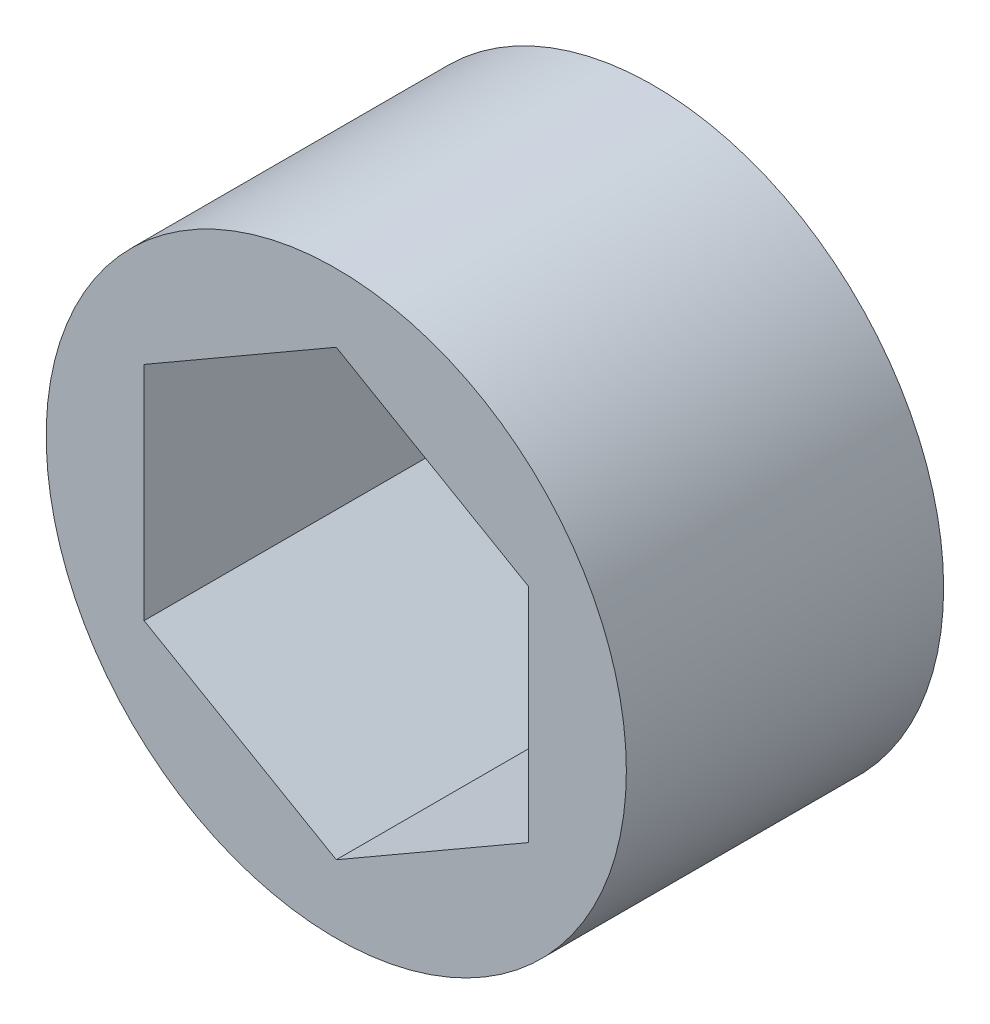
ISO-10303-21;
HEADER;
FILE_DESCRIPTION(('STEP AP214'),'2;1');
FILE_NAME('part.step','',(''),(''),'','','');
FILE_SCHEMA(('AUTOMOTIVE_DESIGN { 1 0 10303 214 1 1 1 1 }'));
ENDSEC;
DATA;
#1=APPLICATION_CONTEXT('core data for automotive mechanical design processes');
#2=APPLICATION_PROTOCOL_DEFINITION('international standard','automotive_design',2000,#1);
#3=PRODUCT_CONTEXT('',#1,'mechanical');
#4=PRODUCT('Part','Part','',(#3));
#5=PRODUCT_RELATED_PRODUCT_CATEGORY('part','',(#4));
#6=PRODUCT_DEFINITION_FORMATION('','',#4);
#7=PRODUCT_DEFINITION_CONTEXT('part definition',#1,'design');
#8=PRODUCT_DEFINITION('design','',#6,#7);
#9=PRODUCT_DEFINITION_SHAPE('','',#8);
#10=(LENGTH_UNIT() NAMED_UNIT(*) SI_UNIT(.MILLI.,.METRE.));
#11=(NAMED_UNIT(*) PLANE_ANGLE_UNIT() SI_UNIT($,.RADIAN.));
#12=(NAMED_UNIT(*) SI_UNIT($,.STERADIAN.) SOLID_ANGLE_UNIT());
#13=UNCERTAINTY_MEASURE_WITH_UNIT(LENGTH_MEASURE(1.E-05),#10,'distance_accuracy_value','');
#14=(GEOMETRIC_REPRESENTATION_CONTEXT(3) GLOBAL_UNCERTAINTY_ASSIGNED_CONTEXT((#13)) GLOBAL_UNIT_ASSIGNED_CONTEXT((#10,
#11,#12)) REPRESENTATION_CONTEXT('',''));
#15=CARTESIAN_POINT('',(0.,0.,0.));
#16=DIRECTION('',(0.,0.,1.));
#17=DIRECTION('',(1.,0.,0.));
#18=AXIS2_PLACEMENT_3D('',#15,#16,#17);
#19=CARTESIAN_POINT('',(0.,0.,5.55625));
#20=DIRECTION('',(0.,0.,1.));
#21=DIRECTION('',(1.,0.,0.));
#22=AXIS2_PLACEMENT_3D('',#19,#20,#21);
#23=PLANE('',#22);
#24=CARTESIAN_POINT('',(0.,0.,5.55625));
#25=DIRECTION('',(0.,0.,1.));
#26=DIRECTION('',(1.,0.,0.));
#27=AXIS2_PLACEMENT_3D('',#24,#25,#26);
#28=CIRCLE('',#27,10.16);
#29=CARTESIAN_POINT('',(10.16,0.,5.55625));
#30=VERTEX_POINT('',#29);
#31=EDGE_CURVE('E11',#30,#30,#28,.T.);
#32=ORIENTED_EDGE('',*,*,#31,.T.);
#33=EDGE_LOOP('',(#32));
#34=FACE_BOUND('',#33,.T.);
#35=DIRECTION('',(-0.866025403784439,-0.5,0.));
#36=VECTOR('',#35,1.);
#37=CARTESIAN_POINT('',(0.,7.77228932383074,5.55625));
#38=LINE('',#37,#36);
#39=CARTESIAN_POINT('',(0.,7.77228932383074,5.55625));
#40=VERTEX_POINT('',#39);
#41=CARTESIAN_POINT('',(-6.731,3.88614466191537,5.55625));
#42=VERTEX_POINT('',#41);
#43=EDGE_CURVE('E98',#40,#42,#38,.T.);
#44=ORIENTED_EDGE('',*,*,#43,.F.);
#45=DIRECTION('',(-0.866025403784439,0.5,0.));
#46=VECTOR('',#45,1.);
#47=CARTESIAN_POINT('',(6.731,3.88614466191537,5.55625));
#48=LINE('',#47,#46);
#49=CARTESIAN_POINT('',(6.731,3.88614466191537,5.55625));
#50=VERTEX_POINT('',#49);
#51=EDGE_CURVE('E90',#50,#40,#48,.T.);
#52=ORIENTED_EDGE('',*,*,#51,.F.);
#53=DIRECTION('',(0.,1.,0.));
#54=VECTOR('',#53,1.);
#55=CARTESIAN_POINT('',(6.731,-3.88614466191537,5.55625));
#56=LINE('',#55,#54);
#57=CARTESIAN_POINT('',(6.731,-3.88614466191537,5.55625));
#58=VERTEX_POINT('',#57);
#59=EDGE_CURVE('E118',#58,#50,#56,.T.);
#60=ORIENTED_EDGE('',*,*,#59,.F.);
#61=DIRECTION('',(0.866025403784439,0.5,0.));
#62=VECTOR('',#61,1.);
#63=CARTESIAN_POINT('',(0.,-7.77228932383074,5.55625));
#64=LINE('',#63,#62);
#65=CARTESIAN_POINT('',(0.,-7.77228932383074,5.55625));
#66=VERTEX_POINT('',#65);
#67=EDGE_CURVE('E116',#66,#58,#64,.T.);
#68=ORIENTED_EDGE('',*,*,#67,.F.);
#69=DIRECTION('',(0.866025403784439,-0.5,0.));
#70=VECTOR('',#69,1.);
#71=CARTESIAN_POINT('',(-6.731,-3.88614466191537,5.55625));
#72=LINE('',#71,#70);
#73=CARTESIAN_POINT('',(-6.731,-3.88614466191537,5.55625));
#74=VERTEX_POINT('',#73);
#75=EDGE_CURVE('E112',#74,#66,#72,.T.);
#76=ORIENTED_EDGE('',*,*,#75,.F.);
#77=DIRECTION('',(0.,-1.,0.));
#78=VECTOR('',#77,1.);
#79=CARTESIAN_POINT('',(-6.731,3.88614466191537,5.55625));
#80=LINE('',#79,#78);
#81=EDGE_CURVE('E110',#42,#74,#80,.T.);
#82=ORIENTED_EDGE('',*,*,#81,.F.);
#83=EDGE_LOOP('',(#44,#52,#60,#68,#76,#82));
#84=FACE_BOUND('',#83,.T.);
#85=ADVANCED_FACE('F37',(#34,#84),#23,.T.);
#86=CARTESIAN_POINT('',(0.,0.,-5.55625));
#87=DIRECTION('',(0.,0.,1.));
#88=DIRECTION('',(1.,0.,0.));
#89=AXIS2_PLACEMENT_3D('',#86,#87,#88);
#90=PLANE('',#89);
#91=CARTESIAN_POINT('',(0.,0.,-5.55625));
#92=DIRECTION('',(0.,0.,1.));
#93=DIRECTION('',(1.,0.,0.));
#94=AXIS2_PLACEMENT_3D('',#91,#92,#93);
#95=CIRCLE('',#94,10.16);
#96=CARTESIAN_POINT('',(10.16,0.,-5.55625));
#97=VERTEX_POINT('',#96);
#98=EDGE_CURVE('E41',#97,#97,#95,.T.);
#99=ORIENTED_EDGE('',*,*,#98,.F.);
#100=EDGE_LOOP('',(#99));
#101=FACE_BOUND('',#100,.T.);
#102=DIRECTION('',(-0.866025403784439,0.5,0.));
#103=VECTOR('',#102,1.);
#104=CARTESIAN_POINT('',(6.731,3.88614466191537,-5.55625));
#105=LINE('',#104,#103);
#106=CARTESIAN_POINT('',(6.731,3.88614466191537,-5.55625));
#107=VERTEX_POINT('',#106);
#108=CARTESIAN_POINT('',(0.,7.77228932383074,-5.55625));
#109=VERTEX_POINT('',#108);
#110=EDGE_CURVE('E60',#107,#109,#105,.T.);
#111=ORIENTED_EDGE('',*,*,#110,.T.);
#112=DIRECTION('',(-0.866025403784439,-0.5,0.));
#113=VECTOR('',#112,1.);
#114=CARTESIAN_POINT('',(0.,7.77228932383074,-5.55625));
#115=LINE('',#114,#113);
#116=CARTESIAN_POINT('',(-6.731,3.88614466191537,-5.55625));
#117=VERTEX_POINT('',#116);
#118=EDGE_CURVE('E105',#109,#117,#115,.T.);
#119=ORIENTED_EDGE('',*,*,#118,.T.);
#120=DIRECTION('',(0.,-1.,0.));
#121=VECTOR('',#120,1.);
#122=CARTESIAN_POINT('',(-6.731,3.88614466191537,-5.55625));
#123=LINE('',#122,#121);
#124=CARTESIAN_POINT('',(-6.731,-3.88614466191537,-5.55625));
#125=VERTEX_POINT('',#124);
#126=EDGE_CURVE('E122',#117,#125,#123,.T.);
#127=ORIENTED_EDGE('',*,*,#126,.T.);
#128=DIRECTION('',(0.866025403784439,-0.5,0.));
#129=VECTOR('',#128,1.);
#130=CARTESIAN_POINT('',(-6.731,-3.88614466191537,-5.55625));
#131=LINE('',#130,#129);
#132=CARTESIAN_POINT('',(0.,-7.77228932383074,-5.55625));
#133=VERTEX_POINT('',#132);
#134=EDGE_CURVE('E125',#125,#133,#131,.T.);
#135=ORIENTED_EDGE('',*,*,#134,.T.);
#136=DIRECTION('',(0.866025403784439,0.5,0.));
#137=VECTOR('',#136,1.);
#138=CARTESIAN_POINT('',(0.,-7.77228932383074,-5.55625));
#139=LINE('',#138,#137);
#140=CARTESIAN_POINT('',(6.731,-3.88614466191537,-5.55625));
#141=VERTEX_POINT('',#140);
#142=EDGE_CURVE('E128',#133,#141,#139,.T.);
#143=ORIENTED_EDGE('',*,*,#142,.T.);
#144=DIRECTION('',(0.,1.,0.));
#145=VECTOR('',#144,1.);
#146=CARTESIAN_POINT('',(6.731,-3.88614466191537,-5.55625));
#147=LINE('',#146,#145);
#148=EDGE_CURVE('E99',#141,#107,#147,.T.);
#149=ORIENTED_EDGE('',*,*,#148,.T.);
#150=EDGE_LOOP('',(#111,#119,#127,#135,#143,#149));
#151=FACE_BOUND('',#150,.T.);
#152=ADVANCED_FACE('F145',(#101,#151),#90,.F.);
#153=CARTESIAN_POINT('',(0.,0.,5.55625));
#154=DIRECTION('',(0.,0.,-1.));
#155=DIRECTION('',(-1.,0.,0.));
#156=AXIS2_PLACEMENT_3D('',#153,#154,#155);
#157=CYLINDRICAL_SURFACE('',#156,10.16);
#158=ORIENTED_EDGE('',*,*,#31,.F.);
#159=EDGE_LOOP('',(#158));
#160=FACE_BOUND('',#159,.T.);
#161=ORIENTED_EDGE('',*,*,#98,.T.);
#162=EDGE_LOOP('',(#161));
#163=FACE_BOUND('',#162,.T.);
#164=ADVANCED_FACE('F39',(#160,#163),#157,.T.);
#165=CARTESIAN_POINT('',(6.731,3.88614466191537,5.55625));
#166=DIRECTION('',(-0.5,-0.866025403784439,0.));
#167=DIRECTION('',(0.866025403784439,-0.5,0.));
#168=AXIS2_PLACEMENT_3D('',#165,#166,#167);
#169=PLANE('',#168);
#170=ORIENTED_EDGE('',*,*,#110,.F.);
#171=DIRECTION('',(0.,0.,-1.));
#172=VECTOR('',#171,1.);
#173=CARTESIAN_POINT('',(6.731,3.88614466191537,5.55625));
#174=LINE('',#173,#172);
#175=EDGE_CURVE('E94',#50,#107,#174,.T.);
#176=ORIENTED_EDGE('',*,*,#175,.F.);
#177=ORIENTED_EDGE('',*,*,#51,.T.);
#178=DIRECTION('',(0.,0.,-1.));
#179=VECTOR('',#178,1.);
#180=CARTESIAN_POINT('',(0.,7.77228932383074,5.55625));
#181=LINE('',#180,#179);
#182=EDGE_CURVE('E93',#40,#109,#181,.T.);
#183=ORIENTED_EDGE('',*,*,#182,.T.);
#184=EDGE_LOOP('',(#170,#176,#177,#183));
#185=FACE_BOUND('',#184,.T.);
#186=ADVANCED_FACE('F92',(#185),#169,.T.);
#187=CARTESIAN_POINT('',(0.,7.77228932383074,5.55625));
#188=DIRECTION('',(0.5,-0.866025403784438,0.));
#189=DIRECTION('',(0.866025403784439,0.5,0.));
#190=AXIS2_PLACEMENT_3D('',#187,#188,#189);
#191=PLANE('',#190);
#192=ORIENTED_EDGE('',*,*,#118,.F.);
#193=ORIENTED_EDGE('',*,*,#182,.F.);
#194=ORIENTED_EDGE('',*,*,#43,.T.);
#195=DIRECTION('',(0.,0.,-1.));
#196=VECTOR('',#195,1.);
#197=CARTESIAN_POINT('',(-6.731,3.88614466191537,5.55625));
#198=LINE('',#197,#196);
#199=EDGE_CURVE('E106',#42,#117,#198,.T.);
#200=ORIENTED_EDGE('',*,*,#199,.T.);
#201=EDGE_LOOP('',(#192,#193,#194,#200));
#202=FACE_BOUND('',#201,.T.);
#203=ADVANCED_FACE('F102',(#202),#191,.T.);
#204=CARTESIAN_POINT('',(-6.731,3.88614466191537,5.55625));
#205=DIRECTION('',(1.,0.,0.));
#206=DIRECTION('',(0.,1.,0.));
#207=AXIS2_PLACEMENT_3D('',#204,#205,#206);
#208=PLANE('',#207);
#209=ORIENTED_EDGE('',*,*,#126,.F.);
#210=ORIENTED_EDGE('',*,*,#199,.F.);
#211=ORIENTED_EDGE('',*,*,#81,.T.);
#212=DIRECTION('',(0.,0.,-1.));
#213=VECTOR('',#212,1.);
#214=CARTESIAN_POINT('',(-6.731,-3.88614466191537,5.55625));
#215=LINE('',#214,#213);
#216=EDGE_CURVE('E137',#74,#125,#215,.T.);
#217=ORIENTED_EDGE('',*,*,#216,.T.);
#218=EDGE_LOOP('',(#209,#210,#211,#217));
#219=FACE_BOUND('',#218,.T.);
#220=ADVANCED_FACE('F141',(#219),#208,.T.);
#221=CARTESIAN_POINT('',(-6.731,-3.88614466191537,5.55625));
#222=DIRECTION('',(0.5,0.866025403784439,0.));
#223=DIRECTION('',(-0.866025403784439,0.5,0.));
#224=AXIS2_PLACEMENT_3D('',#221,#222,#223);
#225=PLANE('',#224);
#226=ORIENTED_EDGE('',*,*,#134,.F.);
#227=ORIENTED_EDGE('',*,*,#216,.F.);
#228=ORIENTED_EDGE('',*,*,#75,.T.);
#229=DIRECTION('',(0.,0.,-1.));
#230=VECTOR('',#229,1.);
#231=CARTESIAN_POINT('',(0.,-7.77228932383074,5.55625));
#232=LINE('',#231,#230);
#233=EDGE_CURVE('E135',#66,#133,#232,.T.);
#234=ORIENTED_EDGE('',*,*,#233,.T.);
#235=EDGE_LOOP('',(#226,#227,#228,#234));
#236=FACE_BOUND('',#235,.T.);
#237=ADVANCED_FACE('F153',(#236),#225,.T.);
#238=CARTESIAN_POINT('',(0.,-7.77228932383074,5.55625));
#239=DIRECTION('',(-0.5,0.866025403784439,0.));
#240=DIRECTION('',(-0.866025403784439,-0.5,0.));
#241=AXIS2_PLACEMENT_3D('',#238,#239,#240);
#242=PLANE('',#241);
#243=ORIENTED_EDGE('',*,*,#142,.F.);
#244=ORIENTED_EDGE('',*,*,#233,.F.);
#245=ORIENTED_EDGE('',*,*,#67,.T.);
#246=DIRECTION('',(0.,0.,-1.));
#247=VECTOR('',#246,1.);
#248=CARTESIAN_POINT('',(6.731,-3.88614466191537,5.55625));
#249=LINE('',#248,#247);
#250=EDGE_CURVE('E52',#58,#141,#249,.T.);
#251=ORIENTED_EDGE('',*,*,#250,.T.);
#252=EDGE_LOOP('',(#243,#244,#245,#251));
#253=FACE_BOUND('',#252,.T.);
#254=ADVANCED_FACE('F151',(#253),#242,.T.);
#255=CARTESIAN_POINT('',(6.731,-3.88614466191537,5.55625));
#256=DIRECTION('',(-1.,0.,0.));
#257=DIRECTION('',(0.,-1.,0.));
#258=AXIS2_PLACEMENT_3D('',#255,#256,#257);
#259=PLANE('',#258);
#260=ORIENTED_EDGE('',*,*,#148,.F.);
#261=ORIENTED_EDGE('',*,*,#250,.F.);
#262=ORIENTED_EDGE('',*,*,#59,.T.);
#263=ORIENTED_EDGE('',*,*,#175,.T.);
#264=EDGE_LOOP('',(#260,#261,#262,#263));
#265=FACE_BOUND('',#264,.T.);
#266=ADVANCED_FACE('F147',(#265),#259,.T.);
#267=CLOSED_SHELL('',(#85,#152,#164,#186,#203,#220,#237,#254,#266));
#268=MANIFOLD_SOLID_BREP('B2',#267);
#269=ADVANCED_BREP_SHAPE_REPRESENTATION('',(#18,#268),#14);
#270=SHAPE_DEFINITION_REPRESENTATION(#9,#269);
ENDSEC;
END-ISO-10303-21;
